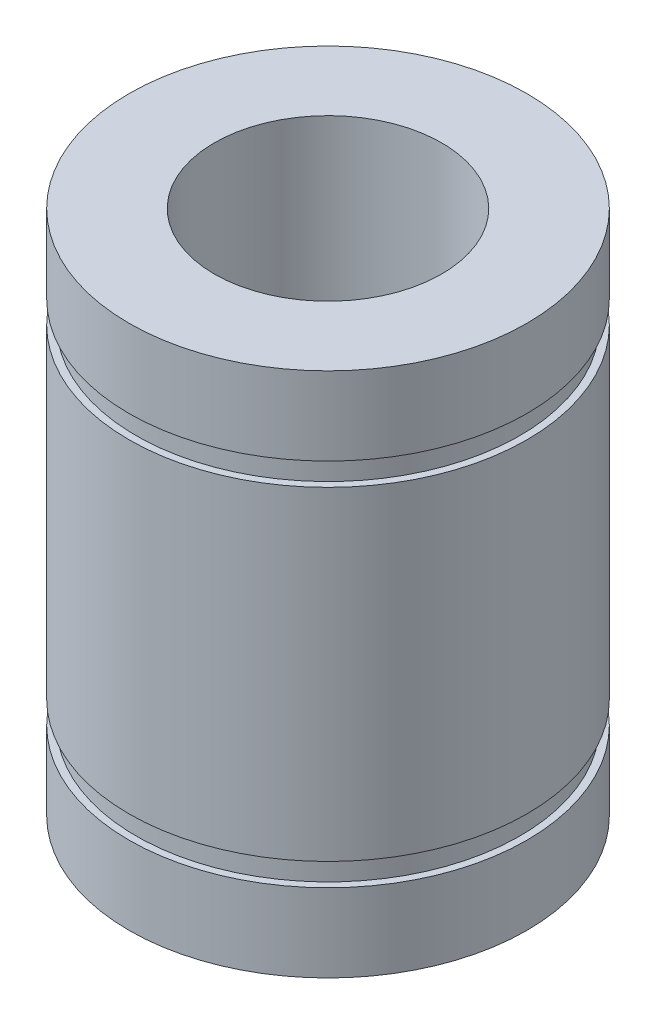
ISO-10303-21;
HEADER;
FILE_DESCRIPTION(('STEP AP214'),'2;1');
FILE_NAME('part.step','',(''),(''),'','','');
FILE_SCHEMA(('AUTOMOTIVE_DESIGN { 1 0 10303 214 1 1 1 1 }'));
ENDSEC;
DATA;
#1=APPLICATION_CONTEXT('core data for automotive mechanical design processes');
#2=APPLICATION_PROTOCOL_DEFINITION('international standard','automotive_design',2000,#1);
#3=PRODUCT_CONTEXT('',#1,'mechanical');
#4=PRODUCT('Part','Part','',(#3));
#5=PRODUCT_RELATED_PRODUCT_CATEGORY('part','',(#4));
#6=PRODUCT_DEFINITION_FORMATION('','',#4);
#7=PRODUCT_DEFINITION_CONTEXT('part definition',#1,'design');
#8=PRODUCT_DEFINITION('design','',#6,#7);
#9=PRODUCT_DEFINITION_SHAPE('','',#8);
#10=(LENGTH_UNIT() NAMED_UNIT(*) SI_UNIT(.MILLI.,.METRE.));
#11=(NAMED_UNIT(*) PLANE_ANGLE_UNIT() SI_UNIT($,.RADIAN.));
#12=(NAMED_UNIT(*) SI_UNIT($,.STERADIAN.) SOLID_ANGLE_UNIT());
#13=UNCERTAINTY_MEASURE_WITH_UNIT(LENGTH_MEASURE(1.E-05),#10,'distance_accuracy_value','');
#14=(GEOMETRIC_REPRESENTATION_CONTEXT(3) GLOBAL_UNCERTAINTY_ASSIGNED_CONTEXT((#13)) GLOBAL_UNIT_ASSIGNED_CONTEXT((#10,
#11,#12)) REPRESENTATION_CONTEXT('',''));
#15=CARTESIAN_POINT('',(0.,0.,0.));
#16=DIRECTION('',(0.,0.,1.));
#17=DIRECTION('',(1.,0.,0.));
#18=AXIS2_PLACEMENT_3D('',#15,#16,#17);
#19=CARTESIAN_POINT('',(0.,37.,0.));
#20=DIRECTION('',(0.,1.,0.));
#21=DIRECTION('',(0.,0.,1.));
#22=AXIS2_PLACEMENT_3D('',#19,#20,#21);
#23=PLANE('',#22);
#24=CARTESIAN_POINT('',(0.,37.,0.));
#25=DIRECTION('',(0.,1.,0.));
#26=DIRECTION('',(0.,0.,1.));
#27=AXIS2_PLACEMENT_3D('',#24,#25,#26);
#28=CIRCLE('',#27,8.);
#29=CARTESIAN_POINT('',(0.,37.,8.));
#30=VERTEX_POINT('',#29);
#31=EDGE_CURVE('E71',#30,#30,#28,.T.);
#32=ORIENTED_EDGE('',*,*,#31,.F.);
#33=EDGE_LOOP('',(#32));
#34=FACE_BOUND('',#33,.T.);
#35=CARTESIAN_POINT('',(0.,37.,0.));
#36=DIRECTION('',(0.,-1.,0.));
#37=DIRECTION('',(0.,0.,-1.));
#38=AXIS2_PLACEMENT_3D('',#35,#36,#37);
#39=CIRCLE('',#38,14.);
#40=CARTESIAN_POINT('',(0.,37.,-14.));
#41=VERTEX_POINT('',#40);
#42=EDGE_CURVE('E10',#41,#41,#39,.T.);
#43=ORIENTED_EDGE('',*,*,#42,.F.);
#44=EDGE_LOOP('',(#43));
#45=FACE_BOUND('',#44,.T.);
#46=ADVANCED_FACE('F33',(#34,#45),#23,.T.);
#47=CARTESIAN_POINT('',(0.,0.,0.));
#48=DIRECTION('',(0.,-1.,0.));
#49=DIRECTION('',(0.,0.,-1.));
#50=AXIS2_PLACEMENT_3D('',#47,#48,#49);
#51=CYLINDRICAL_SURFACE('',#50,14.);
#52=ORIENTED_EDGE('',*,*,#42,.T.);
#53=EDGE_LOOP('',(#52));
#54=FACE_BOUND('',#53,.T.);
#55=CARTESIAN_POINT('',(0.,31.5,0.));
#56=DIRECTION('',(0.,-1.,0.));
#57=DIRECTION('',(0.,0.,-1.));
#58=AXIS2_PLACEMENT_3D('',#55,#56,#57);
#59=CIRCLE('',#58,14.);
#60=CARTESIAN_POINT('',(0.,31.5,-14.));
#61=VERTEX_POINT('',#60);
#62=EDGE_CURVE('E39',#61,#61,#59,.T.);
#63=ORIENTED_EDGE('',*,*,#62,.F.);
#64=EDGE_LOOP('',(#63));
#65=FACE_BOUND('',#64,.T.);
#66=ADVANCED_FACE('F88',(#54,#65),#51,.T.);
#67=CARTESIAN_POINT('',(13.5,31.5,0.));
#68=DIRECTION('',(0.,-1.,0.));
#69=DIRECTION('',(0.,0.,-1.));
#70=AXIS2_PLACEMENT_3D('',#67,#68,#69);
#71=PLANE('',#70);
#72=ORIENTED_EDGE('',*,*,#62,.T.);
#73=EDGE_LOOP('',(#72));
#74=FACE_BOUND('',#73,.T.);
#75=CARTESIAN_POINT('',(0.,31.5,0.));
#76=DIRECTION('',(0.,-1.,0.));
#77=DIRECTION('',(0.,0.,-1.));
#78=AXIS2_PLACEMENT_3D('',#75,#76,#77);
#79=CIRCLE('',#78,13.5);
#80=CARTESIAN_POINT('',(0.,31.5,-13.5));
#81=VERTEX_POINT('',#80);
#82=EDGE_CURVE('E43',#81,#81,#79,.T.);
#83=ORIENTED_EDGE('',*,*,#82,.F.);
#84=EDGE_LOOP('',(#83));
#85=FACE_BOUND('',#84,.T.);
#86=ADVANCED_FACE('F92',(#74,#85),#71,.T.);
#87=CARTESIAN_POINT('',(0.,0.,0.));
#88=DIRECTION('',(0.,-1.,0.));
#89=DIRECTION('',(0.,0.,-1.));
#90=AXIS2_PLACEMENT_3D('',#87,#88,#89);
#91=CYLINDRICAL_SURFACE('',#90,13.5);
#92=ORIENTED_EDGE('',*,*,#82,.T.);
#93=EDGE_LOOP('',(#92));
#94=FACE_BOUND('',#93,.T.);
#95=CARTESIAN_POINT('',(0.,29.9,0.));
#96=DIRECTION('',(0.,-1.,0.));
#97=DIRECTION('',(0.,0.,-1.));
#98=AXIS2_PLACEMENT_3D('',#95,#96,#97);
#99=CIRCLE('',#98,13.5);
#100=CARTESIAN_POINT('',(0.,29.9,-13.5));
#101=VERTEX_POINT('',#100);
#102=EDGE_CURVE('E47',#101,#101,#99,.T.);
#103=ORIENTED_EDGE('',*,*,#102,.F.);
#104=EDGE_LOOP('',(#103));
#105=FACE_BOUND('',#104,.T.);
#106=ADVANCED_FACE('F96',(#94,#105),#91,.T.);
#107=CARTESIAN_POINT('',(13.5,29.9,0.));
#108=DIRECTION('',(0.,1.,0.));
#109=DIRECTION('',(0.,0.,1.));
#110=AXIS2_PLACEMENT_3D('',#107,#108,#109);
#111=PLANE('',#110);
#112=ORIENTED_EDGE('',*,*,#102,.T.);
#113=EDGE_LOOP('',(#112));
#114=FACE_BOUND('',#113,.T.);
#115=CARTESIAN_POINT('',(0.,29.9,0.));
#116=DIRECTION('',(0.,-1.,0.));
#117=DIRECTION('',(0.,0.,-1.));
#118=AXIS2_PLACEMENT_3D('',#115,#116,#117);
#119=CIRCLE('',#118,14.);
#120=CARTESIAN_POINT('',(0.,29.9,-14.));
#121=VERTEX_POINT('',#120);
#122=EDGE_CURVE('E52',#121,#121,#119,.T.);
#123=ORIENTED_EDGE('',*,*,#122,.F.);
#124=EDGE_LOOP('',(#123));
#125=FACE_BOUND('',#124,.T.);
#126=ADVANCED_FACE('F102',(#114,#125),#111,.T.);
#127=CARTESIAN_POINT('',(0.,0.,0.));
#128=DIRECTION('',(0.,-1.,0.));
#129=DIRECTION('',(0.,0.,-1.));
#130=AXIS2_PLACEMENT_3D('',#127,#128,#129);
#131=CYLINDRICAL_SURFACE('',#130,14.);
#132=ORIENTED_EDGE('',*,*,#122,.T.);
#133=EDGE_LOOP('',(#132));
#134=FACE_BOUND('',#133,.T.);
#135=CARTESIAN_POINT('',(0.,7.1,0.));
#136=DIRECTION('',(0.,-1.,0.));
#137=DIRECTION('',(0.,0.,-1.));
#138=AXIS2_PLACEMENT_3D('',#135,#136,#137);
#139=CIRCLE('',#138,14.);
#140=CARTESIAN_POINT('',(0.,7.1,-14.));
#141=VERTEX_POINT('',#140);
#142=EDGE_CURVE('E55',#141,#141,#139,.T.);
#143=ORIENTED_EDGE('',*,*,#142,.F.);
#144=EDGE_LOOP('',(#143));
#145=FACE_BOUND('',#144,.T.);
#146=ADVANCED_FACE('F106',(#134,#145),#131,.T.);
#147=CARTESIAN_POINT('',(13.5,7.1,0.));
#148=DIRECTION('',(0.,-1.,0.));
#149=DIRECTION('',(0.,0.,-1.));
#150=AXIS2_PLACEMENT_3D('',#147,#148,#149);
#151=PLANE('',#150);
#152=ORIENTED_EDGE('',*,*,#142,.T.);
#153=EDGE_LOOP('',(#152));
#154=FACE_BOUND('',#153,.T.);
#155=CARTESIAN_POINT('',(0.,7.1,0.));
#156=DIRECTION('',(0.,-1.,0.));
#157=DIRECTION('',(0.,0.,-1.));
#158=AXIS2_PLACEMENT_3D('',#155,#156,#157);
#159=CIRCLE('',#158,13.5);
#160=CARTESIAN_POINT('',(0.,7.1,-13.5));
#161=VERTEX_POINT('',#160);
#162=EDGE_CURVE('E58',#161,#161,#159,.T.);
#163=ORIENTED_EDGE('',*,*,#162,.F.);
#164=EDGE_LOOP('',(#163));
#165=FACE_BOUND('',#164,.T.);
#166=ADVANCED_FACE('F110',(#154,#165),#151,.T.);
#167=CARTESIAN_POINT('',(0.,0.,0.));
#168=DIRECTION('',(0.,-1.,0.));
#169=DIRECTION('',(0.,0.,-1.));
#170=AXIS2_PLACEMENT_3D('',#167,#168,#169);
#171=CYLINDRICAL_SURFACE('',#170,13.5);
#172=ORIENTED_EDGE('',*,*,#162,.T.);
#173=EDGE_LOOP('',(#172));
#174=FACE_BOUND('',#173,.T.);
#175=CARTESIAN_POINT('',(0.,5.5,0.));
#176=DIRECTION('',(0.,-1.,0.));
#177=DIRECTION('',(0.,0.,-1.));
#178=AXIS2_PLACEMENT_3D('',#175,#176,#177);
#179=CIRCLE('',#178,13.5);
#180=CARTESIAN_POINT('',(0.,5.5,-13.5));
#181=VERTEX_POINT('',#180);
#182=EDGE_CURVE('E61',#181,#181,#179,.T.);
#183=ORIENTED_EDGE('',*,*,#182,.F.);
#184=EDGE_LOOP('',(#183));
#185=FACE_BOUND('',#184,.T.);
#186=ADVANCED_FACE('F114',(#174,#185),#171,.T.);
#187=CARTESIAN_POINT('',(13.5,5.5,0.));
#188=DIRECTION('',(0.,1.,0.));
#189=DIRECTION('',(0.,0.,1.));
#190=AXIS2_PLACEMENT_3D('',#187,#188,#189);
#191=PLANE('',#190);
#192=ORIENTED_EDGE('',*,*,#182,.T.);
#193=EDGE_LOOP('',(#192));
#194=FACE_BOUND('',#193,.T.);
#195=CARTESIAN_POINT('',(0.,5.5,0.));
#196=DIRECTION('',(0.,-1.,0.));
#197=DIRECTION('',(0.,0.,-1.));
#198=AXIS2_PLACEMENT_3D('',#195,#196,#197);
#199=CIRCLE('',#198,14.);
#200=CARTESIAN_POINT('',(0.,5.5,-14.));
#201=VERTEX_POINT('',#200);
#202=EDGE_CURVE('E64',#201,#201,#199,.T.);
#203=ORIENTED_EDGE('',*,*,#202,.F.);
#204=EDGE_LOOP('',(#203));
#205=FACE_BOUND('',#204,.T.);
#206=ADVANCED_FACE('F118',(#194,#205),#191,.T.);
#207=CARTESIAN_POINT('',(0.,0.,0.));
#208=DIRECTION('',(0.,-1.,0.));
#209=DIRECTION('',(0.,0.,-1.));
#210=AXIS2_PLACEMENT_3D('',#207,#208,#209);
#211=CYLINDRICAL_SURFACE('',#210,14.);
#212=ORIENTED_EDGE('',*,*,#202,.T.);
#213=EDGE_LOOP('',(#212));
#214=FACE_BOUND('',#213,.T.);
#215=CARTESIAN_POINT('',(0.,0.,0.));
#216=DIRECTION('',(0.,-1.,0.));
#217=DIRECTION('',(0.,0.,-1.));
#218=AXIS2_PLACEMENT_3D('',#215,#216,#217);
#219=CIRCLE('',#218,14.);
#220=CARTESIAN_POINT('',(0.,0.,-14.));
#221=VERTEX_POINT('',#220);
#222=EDGE_CURVE('E67',#221,#221,#219,.T.);
#223=ORIENTED_EDGE('',*,*,#222,.F.);
#224=EDGE_LOOP('',(#223));
#225=FACE_BOUND('',#224,.T.);
#226=ADVANCED_FACE('F122',(#214,#225),#211,.T.);
#227=CARTESIAN_POINT('',(0.,0.,0.));
#228=DIRECTION('',(0.,-1.,0.));
#229=DIRECTION('',(0.,0.,-1.));
#230=AXIS2_PLACEMENT_3D('',#227,#228,#229);
#231=PLANE('',#230);
#232=CARTESIAN_POINT('',(0.,0.,0.));
#233=DIRECTION('',(0.,1.,0.));
#234=DIRECTION('',(0.,0.,1.));
#235=AXIS2_PLACEMENT_3D('',#232,#233,#234);
#236=CIRCLE('',#235,8.);
#237=CARTESIAN_POINT('',(0.,0.,8.));
#238=VERTEX_POINT('',#237);
#239=EDGE_CURVE('E70',#238,#238,#236,.T.);
#240=ORIENTED_EDGE('',*,*,#239,.T.);
#241=EDGE_LOOP('',(#240));
#242=FACE_BOUND('',#241,.T.);
#243=ORIENTED_EDGE('',*,*,#222,.T.);
#244=EDGE_LOOP('',(#243));
#245=FACE_BOUND('',#244,.T.);
#246=ADVANCED_FACE('F77',(#242,#245),#231,.T.);
#247=CARTESIAN_POINT('',(0.,0.,0.));
#248=DIRECTION('',(0.,1.,0.));
#249=DIRECTION('',(0.,0.,1.));
#250=AXIS2_PLACEMENT_3D('',#247,#248,#249);
#251=CYLINDRICAL_SURFACE('',#250,8.);
#252=ORIENTED_EDGE('',*,*,#239,.F.);
#253=EDGE_LOOP('',(#252));
#254=FACE_BOUND('',#253,.T.);
#255=ORIENTED_EDGE('',*,*,#31,.T.);
#256=EDGE_LOOP('',(#255));
#257=FACE_BOUND('',#256,.T.);
#258=ADVANCED_FACE('F80',(#254,#257),#251,.F.);
#259=CLOSED_SHELL('',(#46,#66,#86,#106,#126,#146,#166,#186,#206,#226,#246,#258));
#260=MANIFOLD_SOLID_BREP('B2',#259);
#261=ADVANCED_BREP_SHAPE_REPRESENTATION('',(#18,#260),#14);
#262=SHAPE_DEFINITION_REPRESENTATION(#9,#261);
ENDSEC;
END-ISO-10303-21;
